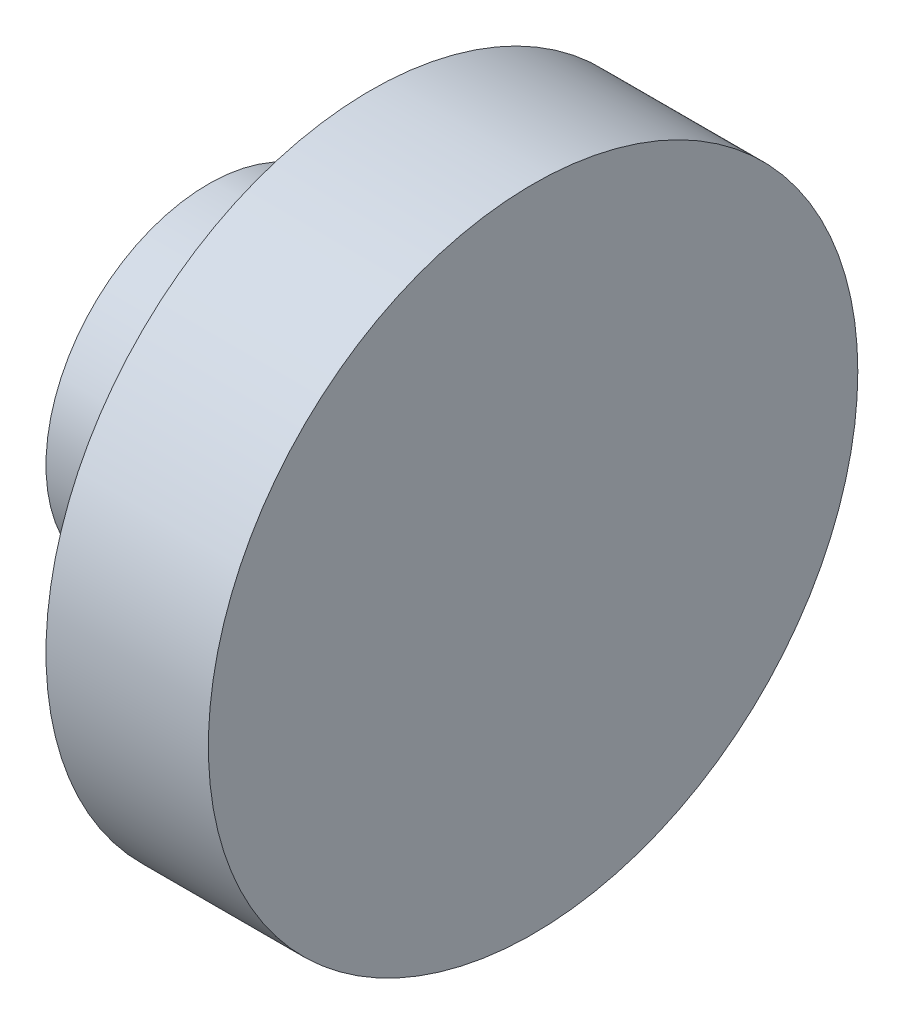
ISO-10303-21;
HEADER;
FILE_DESCRIPTION(('STEP AP214'),'2;1');
FILE_NAME('part.step','',(''),(''),'','','');
FILE_SCHEMA(('AUTOMOTIVE_DESIGN { 1 0 10303 214 1 1 1 1 }'));
ENDSEC;
DATA;
#1=APPLICATION_CONTEXT('core data for automotive mechanical design processes');
#2=APPLICATION_PROTOCOL_DEFINITION('international standard','automotive_design',2000,#1);
#3=PRODUCT_CONTEXT('',#1,'mechanical');
#4=PRODUCT('Part','Part','',(#3));
#5=PRODUCT_RELATED_PRODUCT_CATEGORY('part','',(#4));
#6=PRODUCT_DEFINITION_FORMATION('','',#4);
#7=PRODUCT_DEFINITION_CONTEXT('part definition',#1,'design');
#8=PRODUCT_DEFINITION('design','',#6,#7);
#9=PRODUCT_DEFINITION_SHAPE('','',#8);
#10=(LENGTH_UNIT() NAMED_UNIT(*) SI_UNIT(.MILLI.,.METRE.));
#11=(NAMED_UNIT(*) PLANE_ANGLE_UNIT() SI_UNIT($,.RADIAN.));
#12=(NAMED_UNIT(*) SI_UNIT($,.STERADIAN.) SOLID_ANGLE_UNIT());
#13=UNCERTAINTY_MEASURE_WITH_UNIT(LENGTH_MEASURE(1.E-05),#10,'distance_accuracy_value','');
#14=(GEOMETRIC_REPRESENTATION_CONTEXT(3) GLOBAL_UNCERTAINTY_ASSIGNED_CONTEXT((#13)) GLOBAL_UNIT_ASSIGNED_CONTEXT((#10,
#11,#12)) REPRESENTATION_CONTEXT('',''));
#15=CARTESIAN_POINT('',(0.,0.,0.));
#16=DIRECTION('',(0.,0.,1.));
#17=DIRECTION('',(1.,0.,0.));
#18=AXIS2_PLACEMENT_3D('',#15,#16,#17);
#19=CARTESIAN_POINT('',(12.7,12.7,0.));
#20=DIRECTION('',(-1.,0.,0.));
#21=DIRECTION('',(0.,0.,1.));
#22=AXIS2_PLACEMENT_3D('',#19,#20,#21);
#23=PLANE('',#22);
#24=CARTESIAN_POINT('',(12.7,0.,0.));
#25=DIRECTION('',(1.,0.,0.));
#26=DIRECTION('',(0.,0.,-1.));
#27=AXIS2_PLACEMENT_3D('',#24,#25,#26);
#28=CIRCLE('',#27,12.7);
#29=CARTESIAN_POINT('',(12.7,0.,-12.7));
#30=VERTEX_POINT('',#29);
#31=EDGE_CURVE('E79',#30,#30,#28,.T.);
#32=ORIENTED_EDGE('',*,*,#31,.T.);
#33=EDGE_LOOP('',(#32));
#34=FACE_BOUND('',#33,.T.);
#35=ADVANCED_FACE('F58',(#34),#23,.F.);
#36=CARTESIAN_POINT('',(0.,0.,0.));
#37=DIRECTION('',(1.,0.,0.));
#38=DIRECTION('',(0.,0.,-1.));
#39=AXIS2_PLACEMENT_3D('',#36,#37,#38);
#40=PLANE('',#39);
#41=CARTESIAN_POINT('',(0.,0.,0.));
#42=DIRECTION('',(-1.,0.,0.));
#43=DIRECTION('',(0.,0.,1.));
#44=AXIS2_PLACEMENT_3D('',#41,#42,#43);
#45=CIRCLE('',#44,2.55269999999999);
#46=CARTESIAN_POINT('',(0.,0.,2.55269999999999));
#47=VERTEX_POINT('',#46);
#48=EDGE_CURVE('E80',#47,#47,#45,.T.);
#49=ORIENTED_EDGE('',*,*,#48,.F.);
#50=EDGE_LOOP('',(#49));
#51=FACE_BOUND('',#50,.T.);
#52=CARTESIAN_POINT('',(0.,0.,0.));
#53=DIRECTION('',(1.,0.,0.));
#54=DIRECTION('',(0.,0.,-1.));
#55=AXIS2_PLACEMENT_3D('',#52,#53,#54);
#56=CIRCLE('',#55,6.35);
#57=CARTESIAN_POINT('',(0.,0.,-6.35));
#58=VERTEX_POINT('',#57);
#59=EDGE_CURVE('E13',#58,#58,#56,.T.);
#60=ORIENTED_EDGE('',*,*,#59,.F.);
#61=EDGE_LOOP('',(#60));
#62=FACE_BOUND('',#61,.T.);
#63=ADVANCED_FACE('F103',(#51,#62),#40,.F.);
#64=CARTESIAN_POINT('',(12.7,0.,0.));
#65=DIRECTION('',(1.,0.,0.));
#66=DIRECTION('',(0.,0.,-1.));
#67=AXIS2_PLACEMENT_3D('',#64,#65,#66);
#68=CYLINDRICAL_SURFACE('',#67,6.35);
#69=CARTESIAN_POINT('',(6.35,0.,0.));
#70=DIRECTION('',(1.,0.,0.));
#71=DIRECTION('',(0.,0.,-1.));
#72=AXIS2_PLACEMENT_3D('',#69,#70,#71);
#73=CIRCLE('',#72,6.35);
#74=CARTESIAN_POINT('',(6.35,0.,-6.35));
#75=VERTEX_POINT('',#74);
#76=EDGE_CURVE('E65',#75,#75,#73,.T.);
#77=ORIENTED_EDGE('',*,*,#76,.F.);
#78=EDGE_LOOP('',(#77));
#79=FACE_BOUND('',#78,.T.);
#80=ORIENTED_EDGE('',*,*,#59,.T.);
#81=EDGE_LOOP('',(#80));
#82=FACE_BOUND('',#81,.T.);
#83=ADVANCED_FACE('F100',(#79,#82),#68,.T.);
#84=CARTESIAN_POINT('',(6.35,6.35,0.));
#85=DIRECTION('',(1.,0.,0.));
#86=DIRECTION('',(0.,0.,-1.));
#87=AXIS2_PLACEMENT_3D('',#84,#85,#86);
#88=PLANE('',#87);
#89=CARTESIAN_POINT('',(6.35,0.,0.));
#90=DIRECTION('',(1.,0.,0.));
#91=DIRECTION('',(0.,0.,-1.));
#92=AXIS2_PLACEMENT_3D('',#89,#90,#91);
#93=CIRCLE('',#92,12.7);
#94=CARTESIAN_POINT('',(6.35,0.,-12.7));
#95=VERTEX_POINT('',#94);
#96=EDGE_CURVE('E86',#95,#95,#93,.T.);
#97=ORIENTED_EDGE('',*,*,#96,.F.);
#98=EDGE_LOOP('',(#97));
#99=FACE_BOUND('',#98,.T.);
#100=ORIENTED_EDGE('',*,*,#76,.T.);
#101=EDGE_LOOP('',(#100));
#102=FACE_BOUND('',#101,.T.);
#103=ADVANCED_FACE('F98',(#99,#102),#88,.F.);
#104=CARTESIAN_POINT('',(12.7,0.,0.));
#105=DIRECTION('',(1.,0.,0.));
#106=DIRECTION('',(0.,0.,-1.));
#107=AXIS2_PLACEMENT_3D('',#104,#105,#106);
#108=CYLINDRICAL_SURFACE('',#107,12.7);
#109=ORIENTED_EDGE('',*,*,#31,.F.);
#110=EDGE_LOOP('',(#109));
#111=FACE_BOUND('',#110,.T.);
#112=ORIENTED_EDGE('',*,*,#96,.T.);
#113=EDGE_LOOP('',(#112));
#114=FACE_BOUND('',#113,.T.);
#115=ADVANCED_FACE('F72',(#111,#114),#108,.T.);
#116=CARTESIAN_POINT('',(7.62,0.,0.));
#117=DIRECTION('',(-1.,0.,0.));
#118=DIRECTION('',(0.,0.,1.));
#119=AXIS2_PLACEMENT_3D('',#116,#117,#118);
#120=CONICAL_SURFACE('',#119,2.5527,1.02974425867665);
#121=CARTESIAN_POINT('',(9.15381690219165,0.,0.));
#122=VERTEX_POINT('',#121);
#123=VERTEX_LOOP('',#122);
#124=FACE_BOUND('',#123,.T.);
#125=CARTESIAN_POINT('',(7.62,0.,0.));
#126=DIRECTION('',(-1.,0.,0.));
#127=DIRECTION('',(0.,0.,1.));
#128=AXIS2_PLACEMENT_3D('',#125,#126,#127);
#129=CIRCLE('',#128,2.5527);
#130=CARTESIAN_POINT('',(7.62,0.,2.5527));
#131=VERTEX_POINT('',#130);
#132=EDGE_CURVE('E76',#131,#131,#129,.T.);
#133=ORIENTED_EDGE('',*,*,#132,.T.);
#134=EDGE_LOOP('',(#133));
#135=FACE_BOUND('',#134,.T.);
#136=ADVANCED_FACE('F68',(#124,#135),#120,.F.);
#137=CARTESIAN_POINT('',(0.,0.,0.));
#138=DIRECTION('',(-1.,0.,0.));
#139=DIRECTION('',(0.,0.,1.));
#140=AXIS2_PLACEMENT_3D('',#137,#138,#139);
#141=CYLINDRICAL_SURFACE('',#140,2.55269999999999);
#142=ORIENTED_EDGE('',*,*,#132,.F.);
#143=EDGE_LOOP('',(#142));
#144=FACE_BOUND('',#143,.T.);
#145=ORIENTED_EDGE('',*,*,#48,.T.);
#146=EDGE_LOOP('',(#145));
#147=FACE_BOUND('',#146,.T.);
#148=ADVANCED_FACE('F71',(#144,#147),#141,.F.);
#149=CLOSED_SHELL('',(#35,#63,#83,#103,#115,#136,#148));
#150=MANIFOLD_SOLID_BREP('B2',#149);
#151=ADVANCED_BREP_SHAPE_REPRESENTATION('',(#18,#150),#14);
#152=SHAPE_DEFINITION_REPRESENTATION(#9,#151);
ENDSEC;
END-ISO-10303-21;
